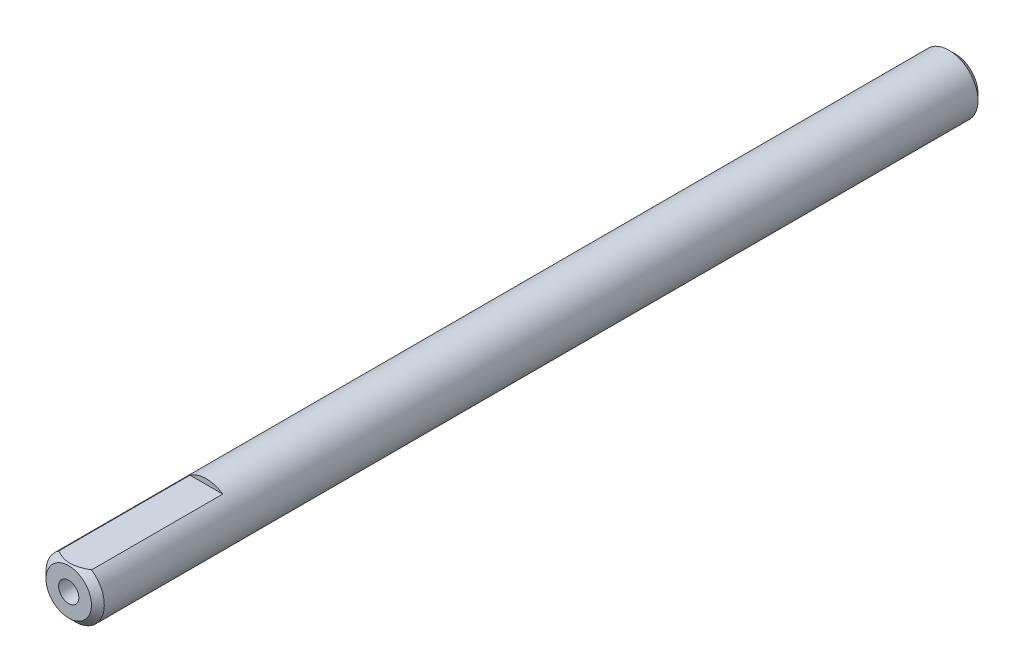
ISO-10303-21;
HEADER;
FILE_DESCRIPTION(('STEP AP214'),'2;1');
FILE_NAME('part.step','',(''),(''),'','','');
FILE_SCHEMA(('AUTOMOTIVE_DESIGN { 1 0 10303 214 1 1 1 1 }'));
ENDSEC;
DATA;
#1=APPLICATION_CONTEXT('core data for automotive mechanical design processes');
#2=APPLICATION_PROTOCOL_DEFINITION('international standard','automotive_design',2000,#1);
#3=PRODUCT_CONTEXT('',#1,'mechanical');
#4=PRODUCT('Part','Part','',(#3));
#5=PRODUCT_RELATED_PRODUCT_CATEGORY('part','',(#4));
#6=PRODUCT_DEFINITION_FORMATION('','',#4);
#7=PRODUCT_DEFINITION_CONTEXT('part definition',#1,'design');
#8=PRODUCT_DEFINITION('design','',#6,#7);
#9=PRODUCT_DEFINITION_SHAPE('','',#8);
#10=(LENGTH_UNIT() NAMED_UNIT(*) SI_UNIT(.MILLI.,.METRE.));
#11=(NAMED_UNIT(*) PLANE_ANGLE_UNIT() SI_UNIT($,.RADIAN.));
#12=(NAMED_UNIT(*) SI_UNIT($,.STERADIAN.) SOLID_ANGLE_UNIT());
#13=UNCERTAINTY_MEASURE_WITH_UNIT(LENGTH_MEASURE(1.E-05),#10,'distance_accuracy_value','');
#14=(GEOMETRIC_REPRESENTATION_CONTEXT(3) GLOBAL_UNCERTAINTY_ASSIGNED_CONTEXT((#13)) GLOBAL_UNIT_ASSIGNED_CONTEXT((#10,
#11,#12)) REPRESENTATION_CONTEXT('',''));
#15=CARTESIAN_POINT('',(0.,0.,0.));
#16=DIRECTION('',(0.,0.,1.));
#17=DIRECTION('',(1.,0.,0.));
#18=AXIS2_PLACEMENT_3D('',#15,#16,#17);
#19=CARTESIAN_POINT('',(0.,0.,96.6));
#20=DIRECTION('',(0.,0.,-1.));
#21=DIRECTION('',(-1.,0.,0.));
#22=AXIS2_PLACEMENT_3D('',#19,#20,#21);
#23=CYLINDRICAL_SURFACE('',#22,3.175);
#24=CARTESIAN_POINT('',(0.,0.,95.9));
#25=DIRECTION('',(0.,0.,1.));
#26=DIRECTION('',(1.,0.,0.));
#27=AXIS2_PLACEMENT_3D('',#24,#25,#26);
#28=CIRCLE('',#27,3.175);
#29=CARTESIAN_POINT('',(1.78605710994918,2.625,95.9));
#30=VERTEX_POINT('',#29);
#31=CARTESIAN_POINT('',(-1.78605710994918,2.625,95.9));
#32=VERTEX_POINT('',#31);
#33=EDGE_CURVE('E73',#30,#32,#28,.F.);
#34=ORIENTED_EDGE('',*,*,#33,.T.);
#35=DIRECTION('',(0.,0.,1.));
#36=VECTOR('',#35,1.);
#37=CARTESIAN_POINT('',(-1.78605710994918,2.625,81.6));
#38=LINE('',#37,#36);
#39=CARTESIAN_POINT('',(-1.78605710994918,2.625,81.6));
#40=VERTEX_POINT('',#39);
#41=EDGE_CURVE('E50',#40,#32,#38,.T.);
#42=ORIENTED_EDGE('',*,*,#41,.F.);
#43=CARTESIAN_POINT('',(0.,0.,81.6));
#44=DIRECTION('',(0.,0.,1.));
#45=DIRECTION('',(1.,0.,0.));
#46=AXIS2_PLACEMENT_3D('',#43,#44,#45);
#47=CIRCLE('',#46,3.175);
#48=CARTESIAN_POINT('',(1.78605710994918,2.625,81.6));
#49=VERTEX_POINT('',#48);
#50=EDGE_CURVE('E62',#49,#40,#47,.T.);
#51=ORIENTED_EDGE('',*,*,#50,.F.);
#52=DIRECTION('',(0.,0.,1.));
#53=VECTOR('',#52,1.);
#54=CARTESIAN_POINT('',(1.78605710994918,2.625,81.6));
#55=LINE('',#54,#53);
#56=EDGE_CURVE('E68',#49,#30,#55,.T.);
#57=ORIENTED_EDGE('',*,*,#56,.T.);
#58=EDGE_LOOP('',(#34,#42,#51,#57));
#59=FACE_BOUND('',#58,.T.);
#60=CARTESIAN_POINT('',(0.,0.,0.700000000000076));
#61=DIRECTION('',(0.,0.,1.));
#62=DIRECTION('',(1.,0.,0.));
#63=AXIS2_PLACEMENT_3D('',#60,#61,#62);
#64=CIRCLE('',#63,3.175);
#65=CARTESIAN_POINT('',(3.175,0.,0.700000000000076));
#66=VERTEX_POINT('',#65);
#67=EDGE_CURVE('E87',#66,#66,#64,.T.);
#68=ORIENTED_EDGE('',*,*,#67,.T.);
#69=EDGE_LOOP('',(#68));
#70=FACE_BOUND('',#69,.T.);
#71=ADVANCED_FACE('F32',(#59,#70),#23,.T.);
#72=CARTESIAN_POINT('',(0.,0.,96.6));
#73=DIRECTION('',(0.,0.,1.));
#74=DIRECTION('',(1.,0.,0.));
#75=AXIS2_PLACEMENT_3D('',#72,#73,#74);
#76=PLANE('',#75);
#77=CARTESIAN_POINT('',(0.,0.,96.6));
#78=DIRECTION('',(0.,0.,1.));
#79=DIRECTION('',(1.,0.,0.));
#80=AXIS2_PLACEMENT_3D('',#77,#78,#79);
#81=CIRCLE('',#80,2.47500000000005);
#82=CARTESIAN_POINT('',(2.47500000000005,0.,96.6));
#83=VERTEX_POINT('',#82);
#84=EDGE_CURVE('E81',#83,#83,#81,.T.);
#85=ORIENTED_EDGE('',*,*,#84,.T.);
#86=EDGE_LOOP('',(#85));
#87=FACE_BOUND('',#86,.T.);
#88=CARTESIAN_POINT('',(0.,0.,96.6));
#89=DIRECTION('',(0.,0.,1.));
#90=DIRECTION('',(1.,0.,0.));
#91=AXIS2_PLACEMENT_3D('',#88,#89,#90);
#92=CIRCLE('',#91,1.1);
#93=CARTESIAN_POINT('',(1.1,0.,96.6));
#94=VERTEX_POINT('',#93);
#95=EDGE_CURVE('E75',#94,#94,#92,.T.);
#96=ORIENTED_EDGE('',*,*,#95,.F.);
#97=EDGE_LOOP('',(#96));
#98=FACE_BOUND('',#97,.T.);
#99=ADVANCED_FACE('F99',(#87,#98),#76,.T.);
#100=CARTESIAN_POINT('',(0.,0.,0.));
#101=DIRECTION('',(0.,0.,1.));
#102=DIRECTION('',(1.,0.,0.));
#103=AXIS2_PLACEMENT_3D('',#100,#101,#102);
#104=PLANE('',#103);
#105=CARTESIAN_POINT('',(0.,0.,0.));
#106=DIRECTION('',(0.,0.,1.));
#107=DIRECTION('',(1.,0.,0.));
#108=AXIS2_PLACEMENT_3D('',#105,#106,#107);
#109=CIRCLE('',#108,2.47499999999991);
#110=CARTESIAN_POINT('',(2.47499999999991,0.,0.));
#111=VERTEX_POINT('',#110);
#112=EDGE_CURVE('E44',#111,#111,#109,.F.);
#113=ORIENTED_EDGE('',*,*,#112,.T.);
#114=EDGE_LOOP('',(#113));
#115=FACE_BOUND('',#114,.T.);
#116=ADVANCED_FACE('F92',(#115),#104,.F.);
#117=CARTESIAN_POINT('',(0.,0.,71.6));
#118=DIRECTION('',(0.,0.,1.));
#119=DIRECTION('',(1.,0.,0.));
#120=AXIS2_PLACEMENT_3D('',#117,#118,#119);
#121=CYLINDRICAL_SURFACE('',#120,1.1);
#122=CARTESIAN_POINT('',(0.,0.,71.6));
#123=DIRECTION('',(0.,0.,1.));
#124=DIRECTION('',(1.,0.,0.));
#125=AXIS2_PLACEMENT_3D('',#122,#123,#124);
#126=CIRCLE('',#125,1.1);
#127=CARTESIAN_POINT('',(1.1,0.,71.6));
#128=VERTEX_POINT('',#127);
#129=EDGE_CURVE('E78',#128,#128,#126,.T.);
#130=ORIENTED_EDGE('',*,*,#129,.F.);
#131=EDGE_LOOP('',(#130));
#132=FACE_BOUND('',#131,.T.);
#133=ORIENTED_EDGE('',*,*,#95,.T.);
#134=EDGE_LOOP('',(#133));
#135=FACE_BOUND('',#134,.T.);
#136=ADVANCED_FACE('F114',(#132,#135),#121,.F.);
#137=CARTESIAN_POINT('',(0.,0.,71.6));
#138=DIRECTION('',(0.,0.,1.));
#139=DIRECTION('',(1.,0.,0.));
#140=AXIS2_PLACEMENT_3D('',#137,#138,#139);
#141=PLANE('',#140);
#142=ORIENTED_EDGE('',*,*,#129,.T.);
#143=EDGE_LOOP('',(#142));
#144=FACE_BOUND('',#143,.T.);
#145=ADVANCED_FACE('F109',(#144),#141,.T.);
#146=CARTESIAN_POINT('',(0.,0.,96.6));
#147=DIRECTION('',(0.,0.,-1.));
#148=DIRECTION('',(-1.,0.,0.));
#149=AXIS2_PLACEMENT_3D('',#146,#147,#148);
#150=CONICAL_SURFACE('',#149,2.47500000000005,0.78539816339745);
#151=CARTESIAN_POINT('',(-3.5754162936336,2.625,94.6394361493965));
#152=CARTESIAN_POINT('',(-3.49038553562687,2.625,94.7079630428631));
#153=CARTESIAN_POINT('',(-3.40494671081254,2.625,94.7759907736145));
#154=CARTESIAN_POINT('',(-3.23307079181197,2.625,94.910807920445));
#155=CARTESIAN_POINT('',(-3.14663350054826,2.625,94.9775970850357));
#156=CARTESIAN_POINT('',(-2.97196021356059,2.625,95.1101644566831));
#157=CARTESIAN_POINT('',(-2.88371559110073,2.625,95.175931330476));
#158=CARTESIAN_POINT('',(-2.7058543523959,2.625,95.3055751960639));
#159=CARTESIAN_POINT('',(-2.61623782702483,2.625,95.3694523122202));
#160=CARTESIAN_POINT('',(-2.42790119795026,2.625,95.5000388631979));
#161=CARTESIAN_POINT('',(-2.32904050652681,2.625,95.5665465162449));
#162=CARTESIAN_POINT('',(-2.1289929141249,2.625,95.6960329232165));
#163=CARTESIAN_POINT('',(-2.027805564719,2.625,95.7590109886899));
#164=CARTESIAN_POINT('',(-1.82297600010983,2.625,95.8801504617569));
#165=CARTESIAN_POINT('',(-1.719342057185,2.625,95.938325748165));
#166=CARTESIAN_POINT('',(-1.50889446269495,2.625,96.0485572624839));
#167=CARTESIAN_POINT('',(-1.40208249875738,2.625,96.1006166679195));
#168=CARTESIAN_POINT('',(-1.20014961319526,2.625,96.189867956824));
#169=CARTESIAN_POINT('',(-1.10550253007634,2.625,96.2281211549049));
#170=CARTESIAN_POINT('',(-0.913437592412659,2.625,96.2970571406081));
#171=CARTESIAN_POINT('',(-0.816019582885646,2.625,96.3277395038495));
#172=CARTESIAN_POINT('',(-0.620939268345508,2.625,96.3791597828923));
#173=CARTESIAN_POINT('',(-0.523333946298817,2.625,96.4001098828497));
#174=CARTESIAN_POINT('',(-0.326444611908565,2.625,96.4315610954298));
#175=CARTESIAN_POINT('',(-0.227161187839126,2.625,96.4420657955688));
#176=CARTESIAN_POINT('',(-0.0350471857047909,2.625,96.4513949583716));
#177=CARTESIAN_POINT('',(0.0577458812953086,2.625,96.4509892764094));
#178=CARTESIAN_POINT('',(0.242769116114158,2.625,96.4404168751232));
#179=CARTESIAN_POINT('',(0.33499924466149,2.625,96.4302494824662));
#180=CARTESIAN_POINT('',(0.519825594531954,2.625,96.4006132056887));
#181=CARTESIAN_POINT('',(0.612392002006642,2.625,96.3809617079007));
#182=CARTESIAN_POINT('',(0.795383861892932,2.625,96.3335684064944));
#183=CARTESIAN_POINT('',(0.885809249279158,2.625,96.3058263574962));
#184=CARTESIAN_POINT('',(1.15075810432027,2.625,96.2135909236949));
#185=CARTESIAN_POINT('',(1.32194947017122,2.625,96.1395187561451));
#186=CARTESIAN_POINT('',(1.57252446058268,2.625,96.0158846470271));
#187=CARTESIAN_POINT('',(1.65516198439235,2.625,95.9724931991988));
#188=CARTESIAN_POINT('',(1.81857256013799,2.625,95.8823235876424));
#189=CARTESIAN_POINT('',(1.89934592478318,2.625,95.8355459974598));
#190=CARTESIAN_POINT('',(2.05526700867759,2.625,95.7416727723897));
#191=CARTESIAN_POINT('',(2.13049475739033,2.625,95.694708587596));
#192=CARTESIAN_POINT('',(2.27965973380038,2.625,95.5987644026394));
#193=CARTESIAN_POINT('',(2.35359686678753,2.625,95.5497842554161));
#194=CARTESIAN_POINT('',(2.49976292304976,2.625,95.4505583294643));
#195=CARTESIAN_POINT('',(2.57200071458181,2.625,95.4003255602272));
#196=CARTESIAN_POINT('',(2.71548331674143,2.625,95.2985008837005));
#197=CARTESIAN_POINT('',(2.78672839424345,2.625,95.2469093529073));
#198=CARTESIAN_POINT('',(2.85755661918636,2.625,95.1947609826384));
#199=B_SPLINE_CURVE_WITH_KNOTS('',3,(#151,#152,#153,#154,#155,#156,#157,#158,#159,#160,#161,
#162,#163,#164,#165,#166,#167,#168,#169,#170,#171,#172,#173,#174,#175,#176,#177,#178,#179,#180,
#181,#182,#183,#184,#185,#186,#187,#188,#189,#190,#191,#192,#193,#194,#195,#196,#197,#198),
.UNSPECIFIED.,.F.,.F.,(4,2,2,2,2,2,2,2,2,2,2,2,2,2,2,2,2,2,2,2,2,2,2,4),(0.,0.327625741609322,
0.655317294236553,0.985465587794534,1.31559210637862,1.67298335749974,2.03044407741558,
2.38683276600295,2.74303546509696,3.0490378139486,3.35505731177749,3.65404937553505,
3.95293871371082,4.23079709371639,4.50867464092408,4.79213007192764,5.075594100802,
5.63347712575048,5.91346203058551,6.1933996219842,6.45941877036766,6.72545735883957,
6.98940022626674,7.25327071216044),.UNSPECIFIED.);
#200=EDGE_CURVE('E11',#32,#30,#199,.T.);
#201=ORIENTED_EDGE('',*,*,#200,.F.);
#202=ORIENTED_EDGE('',*,*,#33,.F.);
#203=EDGE_LOOP('',(#201,#202));
#204=FACE_BOUND('',#203,.T.);
#205=ORIENTED_EDGE('',*,*,#84,.F.);
#206=EDGE_LOOP('',(#205));
#207=FACE_BOUND('',#206,.T.);
#208=ADVANCED_FACE('F96',(#204,#207),#150,.T.);
#209=CARTESIAN_POINT('',(0.,0.,0.700000000000076));
#210=DIRECTION('',(0.,0.,1.));
#211=DIRECTION('',(1.,0.,0.));
#212=AXIS2_PLACEMENT_3D('',#209,#210,#211);
#213=CONICAL_SURFACE('',#212,3.175,0.78539816339746);
#214=CARTESIAN_POINT('',(2.47499999999991,0.,0.));
#215=CARTESIAN_POINT('',(2.48229166666657,0.,0.00729166666666728));
#216=CARTESIAN_POINT('',(2.48958333333324,0.,0.0145833333333347));
#217=CARTESIAN_POINT('',(2.50416666666658,0.,0.0291666666666697));
#218=CARTESIAN_POINT('',(2.51145833333325,0.,0.0364583333333372));
#219=CARTESIAN_POINT('',(2.52604166666658,0.,0.0510416666666721));
#220=CARTESIAN_POINT('',(2.53333333333325,0.,0.0583333333333395));
#221=CARTESIAN_POINT('',(2.54791666666658,0.,0.0729166666666744));
#222=CARTESIAN_POINT('',(2.55520833333325,0.,0.0802083333333419));
#223=CARTESIAN_POINT('',(2.56979166666659,0.,0.0947916666666768));
#224=CARTESIAN_POINT('',(2.57708333333325,0.,0.102083333333344));
#225=CARTESIAN_POINT('',(2.59166666666659,0.,0.116666666666679));
#226=CARTESIAN_POINT('',(2.59895833333326,0.,0.123958333333347));
#227=CARTESIAN_POINT('',(2.61354166666659,0.,0.138541666666682));
#228=CARTESIAN_POINT('',(2.62083333333326,0.,0.145833333333349));
#229=CARTESIAN_POINT('',(2.6354166666666,0.,0.160416666666684));
#230=CARTESIAN_POINT('',(2.64270833333326,0.,0.167708333333351));
#231=CARTESIAN_POINT('',(2.6572916666666,0.,0.182291666666686));
#232=CARTESIAN_POINT('',(2.66458333333327,0.,0.189583333333354));
#233=CARTESIAN_POINT('',(2.6791666666666,0.,0.204166666666689));
#234=CARTESIAN_POINT('',(2.68645833333327,0.,0.211458333333356));
#235=CARTESIAN_POINT('',(2.7010416666666,0.,0.226041666666691));
#236=CARTESIAN_POINT('',(2.70833333333327,0.,0.233333333333358));
#237=CARTESIAN_POINT('',(2.72291666666661,0.,0.247916666666693));
#238=CARTESIAN_POINT('',(2.73020833333327,0.,0.255208333333361));
#239=CARTESIAN_POINT('',(2.74479166666661,0.,0.269791666666696));
#240=CARTESIAN_POINT('',(2.75208333333328,0.,0.277083333333363));
#241=CARTESIAN_POINT('',(2.76666666666661,0.,0.291666666666698));
#242=CARTESIAN_POINT('',(2.77395833333328,0.,0.298958333333366));
#243=CARTESIAN_POINT('',(2.78854166666662,0.,0.3135416666667));
#244=CARTESIAN_POINT('',(2.79583333333328,0.,0.320833333333368));
#245=CARTESIAN_POINT('',(2.81041666666662,0.,0.335416666666703));
#246=CARTESIAN_POINT('',(2.81770833333329,0.,0.34270833333337));
#247=CARTESIAN_POINT('',(2.83229166666662,0.,0.357291666666705));
#248=CARTESIAN_POINT('',(2.83958333333329,0.,0.364583333333373));
#249=CARTESIAN_POINT('',(2.85416666666662,0.,0.379166666666708));
#250=CARTESIAN_POINT('',(2.86145833333329,0.,0.386458333333375));
#251=CARTESIAN_POINT('',(2.87604166666663,0.,0.40104166666671));
#252=CARTESIAN_POINT('',(2.88333333333329,0.,0.408333333333377));
#253=CARTESIAN_POINT('',(2.89791666666663,0.,0.422916666666712));
#254=CARTESIAN_POINT('',(2.9052083333333,0.,0.43020833333338));
#255=CARTESIAN_POINT('',(2.91979166666663,0.,0.444791666666715));
#256=CARTESIAN_POINT('',(2.9270833333333,0.,0.452083333333382));
#257=CARTESIAN_POINT('',(2.94166666666664,0.,0.466666666666717));
#258=CARTESIAN_POINT('',(2.9489583333333,0.,0.473958333333384));
#259=CARTESIAN_POINT('',(2.96354166666664,0.,0.488541666666719));
#260=CARTESIAN_POINT('',(2.97083333333331,0.,0.495833333333387));
#261=CARTESIAN_POINT('',(2.98541666666664,0.,0.510416666666722));
#262=CARTESIAN_POINT('',(2.99270833333331,0.,0.517708333333389));
#263=CARTESIAN_POINT('',(3.00729166666664,0.,0.532291666666724));
#264=CARTESIAN_POINT('',(3.01458333333331,0.,0.539583333333392));
#265=CARTESIAN_POINT('',(3.02916666666665,0.,0.554166666666727));
#266=CARTESIAN_POINT('',(3.03645833333332,0.,0.561458333333394));
#267=CARTESIAN_POINT('',(3.05104166666665,0.,0.576041666666729));
#268=CARTESIAN_POINT('',(3.05833333333332,0.,0.583333333333396));
#269=CARTESIAN_POINT('',(3.07291666666665,0.,0.597916666666731));
#270=CARTESIAN_POINT('',(3.08020833333332,0.,0.605208333333399));
#271=CARTESIAN_POINT('',(3.09479166666666,0.,0.619791666666734));
#272=CARTESIAN_POINT('',(3.10208333333332,0.,0.627083333333401));
#273=CARTESIAN_POINT('',(3.11666666666666,0.,0.641666666666736));
#274=CARTESIAN_POINT('',(3.12395833333333,0.,0.648958333333403));
#275=CARTESIAN_POINT('',(3.13854166666666,0.,0.663541666666738));
#276=CARTESIAN_POINT('',(3.14583333333333,0.,0.670833333333406));
#277=CARTESIAN_POINT('',(3.16041666666666,0.,0.685416666666741));
#278=CARTESIAN_POINT('',(3.16770833333333,0.,0.692708333333408));
#279=CARTESIAN_POINT('',(3.175,0.,0.700000000000076));
#280=B_SPLINE_CURVE_WITH_KNOTS('',3,(#214,#215,#216,#217,#218,#219,#220,#221,#222,#223,#224,
#225,#226,#227,#228,#229,#230,#231,#232,#233,#234,#235,#236,#237,#238,#239,#240,#241,#242,#243,
#244,#245,#246,#247,#248,#249,#250,#251,#252,#253,#254,#255,#256,#257,#258,#259,#260,#261,#262,
#263,#264,#265,#266,#267,#268,#269,#270,#271,#272,#273,#274,#275,#276,#277,#278,#279),
.UNSPECIFIED.,.F.,.F.,(4,2,2,2,2,2,2,2,2,2,2,2,2,2,2,2,2,2,2,2,2,2,2,2,2,2,2,2,2,2,2,2,4),(0.,
0.0309359216769154,0.0618718433538305,0.0928077650307456,0.123743686707661,0.154679608384576,
0.185615530061491,0.216551451738406,0.247487373415321,0.278423295092237,0.309359216769152,
0.340295138446067,0.371231060122982,0.402166981799898,0.433102903476813,0.464038825153728,
0.494974746830643,0.525910668507558,0.556846590184473,0.587782511861388,0.618718433538303,
0.649654355215219,0.680590276892134,0.711526198569049,0.742462120245964,0.773398041922879,
0.804333963599795,0.83526988527671,0.866205806953625,0.89714172863054,0.928077650307455,
0.95901357198437,0.989949493661286),.UNSPECIFIED.);
#281=EDGE_CURVE('BSEAM34',#111,#66,#280,.T.);
#282=ORIENTED_EDGE('',*,*,#112,.F.);
#283=ORIENTED_EDGE('',*,*,#67,.F.);
#284=ORIENTED_EDGE('',*,*,#281,.T.);
#285=ORIENTED_EDGE('',*,*,#281,.F.);
#286=EDGE_LOOP('',(#282,#284,#283,#285));
#287=FACE_BOUND('',#286,.T.);
#288=ADVANCED_FACE('F34',(#287),#213,.T.);
#289=CARTESIAN_POINT('',(-1.78605710994918,2.625,81.6));
#290=DIRECTION('',(0.,-1.,0.));
#291=DIRECTION('',(0.,0.,-1.));
#292=AXIS2_PLACEMENT_3D('',#289,#290,#291);
#293=PLANE('',#292);
#294=ORIENTED_EDGE('',*,*,#200,.T.);
#295=ORIENTED_EDGE('',*,*,#56,.F.);
#296=DIRECTION('',(1.,0.,0.));
#297=VECTOR('',#296,1.);
#298=CARTESIAN_POINT('',(-1.78605710994918,2.625,81.6));
#299=LINE('',#298,#297);
#300=EDGE_CURVE('E64',#40,#49,#299,.T.);
#301=ORIENTED_EDGE('',*,*,#300,.F.);
#302=ORIENTED_EDGE('',*,*,#41,.T.);
#303=EDGE_LOOP('',(#294,#295,#301,#302));
#304=FACE_BOUND('',#303,.T.);
#305=ADVANCED_FACE('F67',(#304),#293,.F.);
#306=CARTESIAN_POINT('',(0.,0.,81.6));
#307=DIRECTION('',(0.,0.,1.));
#308=DIRECTION('',(1.,0.,0.));
#309=AXIS2_PLACEMENT_3D('',#306,#307,#308);
#310=PLANE('',#309);
#311=ORIENTED_EDGE('',*,*,#50,.T.);
#312=ORIENTED_EDGE('',*,*,#300,.T.);
#313=EDGE_LOOP('',(#311,#312));
#314=FACE_BOUND('',#313,.T.);
#315=ADVANCED_FACE('F63',(#314),#310,.T.);
#316=CLOSED_SHELL('',(#71,#99,#116,#136,#145,#208,#288,#305,#315));
#317=MANIFOLD_SOLID_BREP('B2',#316);
#318=ADVANCED_BREP_SHAPE_REPRESENTATION('',(#18,#317),#14);
#319=SHAPE_DEFINITION_REPRESENTATION(#9,#318);
ENDSEC;
END-ISO-10303-21;
